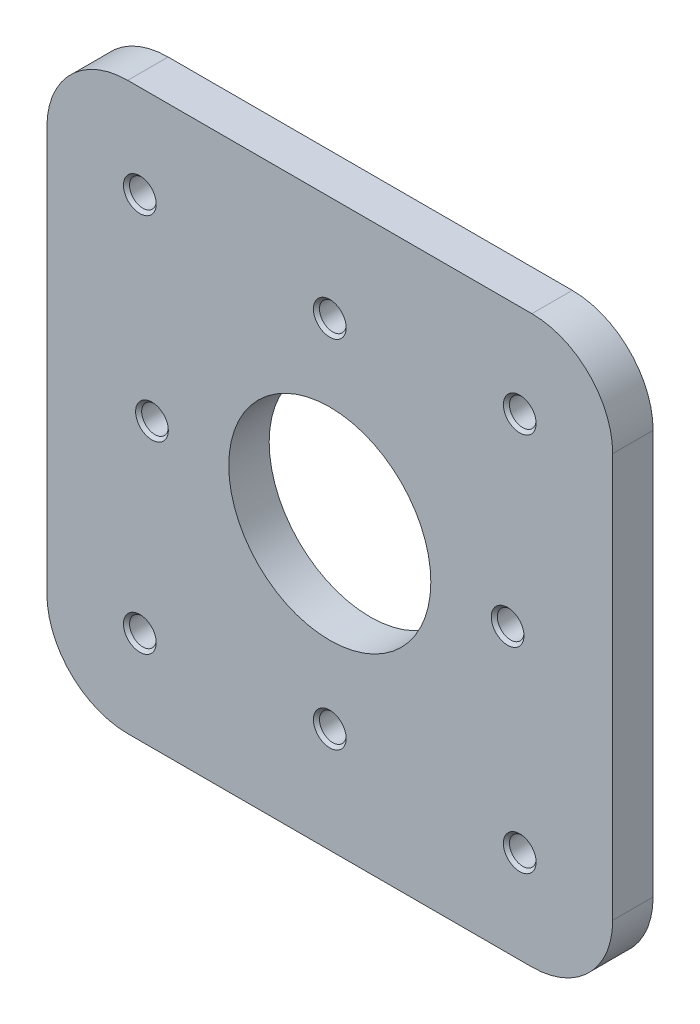
ISO-10303-21;
HEADER;
FILE_DESCRIPTION(('STEP AP214'),'2;1');
FILE_NAME('part.step','',(''),(''),'','','');
FILE_SCHEMA(('AUTOMOTIVE_DESIGN { 1 0 10303 214 1 1 1 1 }'));
ENDSEC;
DATA;
#1=APPLICATION_CONTEXT('core data for automotive mechanical design processes');
#2=APPLICATION_PROTOCOL_DEFINITION('international standard','automotive_design',2000,#1);
#3=PRODUCT_CONTEXT('',#1,'mechanical');
#4=PRODUCT('Part','Part','',(#3));
#5=PRODUCT_RELATED_PRODUCT_CATEGORY('part','',(#4));
#6=PRODUCT_DEFINITION_FORMATION('','',#4);
#7=PRODUCT_DEFINITION_CONTEXT('part definition',#1,'design');
#8=PRODUCT_DEFINITION('design','',#6,#7);
#9=PRODUCT_DEFINITION_SHAPE('','',#8);
#10=(LENGTH_UNIT() NAMED_UNIT(*) SI_UNIT(.MILLI.,.METRE.));
#11=(NAMED_UNIT(*) PLANE_ANGLE_UNIT() SI_UNIT($,.RADIAN.));
#12=(NAMED_UNIT(*) SI_UNIT($,.STERADIAN.) SOLID_ANGLE_UNIT());
#13=UNCERTAINTY_MEASURE_WITH_UNIT(LENGTH_MEASURE(1.E-05),#10,'distance_accuracy_value','');
#14=(GEOMETRIC_REPRESENTATION_CONTEXT(3) GLOBAL_UNCERTAINTY_ASSIGNED_CONTEXT((#13)) GLOBAL_UNIT_ASSIGNED_CONTEXT((#10,
#11,#12)) REPRESENTATION_CONTEXT('',''));
#15=CARTESIAN_POINT('',(0.,0.,0.));
#16=DIRECTION('',(0.,0.,1.));
#17=DIRECTION('',(1.,0.,0.));
#18=AXIS2_PLACEMENT_3D('',#15,#16,#17);
#19=CARTESIAN_POINT('',(35.,-35.,-5.));
#20=DIRECTION('',(1.,0.,0.));
#21=DIRECTION('',(0.,0.,-1.));
#22=AXIS2_PLACEMENT_3D('',#19,#20,#21);
#23=PLANE('',#22);
#24=DIRECTION('',(0.,1.,0.));
#25=VECTOR('',#24,1.);
#26=CARTESIAN_POINT('',(35.,-35.,-5.));
#27=LINE('',#26,#25);
#28=CARTESIAN_POINT('',(35.,-25.,-5.));
#29=VERTEX_POINT('',#28);
#30=CARTESIAN_POINT('',(35.,25.,-5.));
#31=VERTEX_POINT('',#30);
#32=EDGE_CURVE('E170',#29,#31,#27,.T.);
#33=ORIENTED_EDGE('',*,*,#32,.T.);
#34=DIRECTION('',(0.,0.,1.));
#35=VECTOR('',#34,1.);
#36=CARTESIAN_POINT('',(35.,25.,-5.));
#37=LINE('',#36,#35);
#38=CARTESIAN_POINT('',(35.,25.,0.));
#39=VERTEX_POINT('',#38);
#40=EDGE_CURVE('E122',#31,#39,#37,.T.);
#41=ORIENTED_EDGE('',*,*,#40,.T.);
#42=DIRECTION('',(0.,1.,0.));
#43=VECTOR('',#42,1.);
#44=CARTESIAN_POINT('',(35.,-35.,0.));
#45=LINE('',#44,#43);
#46=CARTESIAN_POINT('',(35.,-25.,0.));
#47=VERTEX_POINT('',#46);
#48=EDGE_CURVE('E106',#47,#39,#45,.T.);
#49=ORIENTED_EDGE('',*,*,#48,.F.);
#50=DIRECTION('',(0.,0.,1.));
#51=VECTOR('',#50,1.);
#52=CARTESIAN_POINT('',(35.,-25.,-5.));
#53=LINE('',#52,#51);
#54=EDGE_CURVE('E119',#47,#29,#53,.F.);
#55=ORIENTED_EDGE('',*,*,#54,.T.);
#56=EDGE_LOOP('',(#33,#41,#49,#55));
#57=FACE_BOUND('',#56,.T.);
#58=ADVANCED_FACE('F37',(#57),#23,.T.);
#59=CARTESIAN_POINT('',(-35.,-35.,-5.));
#60=DIRECTION('',(0.,-1.,0.));
#61=DIRECTION('',(0.,0.,-1.));
#62=AXIS2_PLACEMENT_3D('',#59,#60,#61);
#63=PLANE('',#62);
#64=DIRECTION('',(1.,0.,0.));
#65=VECTOR('',#64,1.);
#66=CARTESIAN_POINT('',(-35.,-35.,-5.));
#67=LINE('',#66,#65);
#68=CARTESIAN_POINT('',(-25.,-35.,-5.));
#69=VERTEX_POINT('',#68);
#70=CARTESIAN_POINT('',(25.,-35.,-5.));
#71=VERTEX_POINT('',#70);
#72=EDGE_CURVE('E129',#69,#71,#67,.T.);
#73=ORIENTED_EDGE('',*,*,#72,.T.);
#74=DIRECTION('',(0.,0.,1.));
#75=VECTOR('',#74,1.);
#76=CARTESIAN_POINT('',(25.,-35.,-5.));
#77=LINE('',#76,#75);
#78=CARTESIAN_POINT('',(25.,-35.,0.));
#79=VERTEX_POINT('',#78);
#80=EDGE_CURVE('E156',#71,#79,#77,.T.);
#81=ORIENTED_EDGE('',*,*,#80,.T.);
#82=DIRECTION('',(1.,0.,0.));
#83=VECTOR('',#82,1.);
#84=CARTESIAN_POINT('',(-35.,-35.,0.));
#85=LINE('',#84,#83);
#86=CARTESIAN_POINT('',(-25.,-35.,0.));
#87=VERTEX_POINT('',#86);
#88=EDGE_CURVE('E108',#87,#79,#85,.T.);
#89=ORIENTED_EDGE('',*,*,#88,.F.);
#90=DIRECTION('',(0.,0.,1.));
#91=VECTOR('',#90,1.);
#92=CARTESIAN_POINT('',(-25.,-35.,-5.));
#93=LINE('',#92,#91);
#94=EDGE_CURVE('E154',#87,#69,#93,.F.);
#95=ORIENTED_EDGE('',*,*,#94,.T.);
#96=EDGE_LOOP('',(#73,#81,#89,#95));
#97=FACE_BOUND('',#96,.T.);
#98=ADVANCED_FACE('F158',(#97),#63,.T.);
#99=CARTESIAN_POINT('',(-35.,-35.,-5.));
#100=DIRECTION('',(-1.,0.,0.));
#101=DIRECTION('',(0.,0.,1.));
#102=AXIS2_PLACEMENT_3D('',#99,#100,#101);
#103=PLANE('',#102);
#104=DIRECTION('',(0.,-1.,0.));
#105=VECTOR('',#104,1.);
#106=CARTESIAN_POINT('',(-35.,-35.,-5.));
#107=LINE('',#106,#105);
#108=CARTESIAN_POINT('',(-35.,25.,-5.));
#109=VERTEX_POINT('',#108);
#110=CARTESIAN_POINT('',(-35.,-25.,-5.));
#111=VERTEX_POINT('',#110);
#112=EDGE_CURVE('E134',#109,#111,#107,.T.);
#113=ORIENTED_EDGE('',*,*,#112,.T.);
#114=DIRECTION('',(0.,0.,1.));
#115=VECTOR('',#114,1.);
#116=CARTESIAN_POINT('',(-35.,-25.,-5.));
#117=LINE('',#116,#115);
#118=CARTESIAN_POINT('',(-35.,-25.,0.));
#119=VERTEX_POINT('',#118);
#120=EDGE_CURVE('E11',#111,#119,#117,.T.);
#121=ORIENTED_EDGE('',*,*,#120,.T.);
#122=DIRECTION('',(0.,-1.,0.));
#123=VECTOR('',#122,1.);
#124=CARTESIAN_POINT('',(-35.,-35.,0.));
#125=LINE('',#124,#123);
#126=CARTESIAN_POINT('',(-35.,25.,0.));
#127=VERTEX_POINT('',#126);
#128=EDGE_CURVE('E167',#127,#119,#125,.T.);
#129=ORIENTED_EDGE('',*,*,#128,.F.);
#130=DIRECTION('',(0.,0.,1.));
#131=VECTOR('',#130,1.);
#132=CARTESIAN_POINT('',(-35.,25.,-5.));
#133=LINE('',#132,#131);
#134=EDGE_CURVE('E45',#127,#109,#133,.F.);
#135=ORIENTED_EDGE('',*,*,#134,.T.);
#136=EDGE_LOOP('',(#113,#121,#129,#135));
#137=FACE_BOUND('',#136,.T.);
#138=ADVANCED_FACE('F166',(#137),#103,.T.);
#139=CARTESIAN_POINT('',(-35.,35.,-5.));
#140=DIRECTION('',(0.,1.,0.));
#141=DIRECTION('',(0.,0.,1.));
#142=AXIS2_PLACEMENT_3D('',#139,#140,#141);
#143=PLANE('',#142);
#144=DIRECTION('',(-1.,0.,0.));
#145=VECTOR('',#144,1.);
#146=CARTESIAN_POINT('',(-35.,35.,0.));
#147=LINE('',#146,#145);
#148=CARTESIAN_POINT('',(25.,35.,0.));
#149=VERTEX_POINT('',#148);
#150=CARTESIAN_POINT('',(-25.,35.,0.));
#151=VERTEX_POINT('',#150);
#152=EDGE_CURVE('E123',#149,#151,#147,.T.);
#153=ORIENTED_EDGE('',*,*,#152,.F.);
#154=DIRECTION('',(0.,0.,1.));
#155=VECTOR('',#154,1.);
#156=CARTESIAN_POINT('',(25.,35.,-5.));
#157=LINE('',#156,#155);
#158=CARTESIAN_POINT('',(25.,35.,-5.));
#159=VERTEX_POINT('',#158);
#160=EDGE_CURVE('E146',#149,#159,#157,.F.);
#161=ORIENTED_EDGE('',*,*,#160,.T.);
#162=DIRECTION('',(-1.,0.,0.));
#163=VECTOR('',#162,1.);
#164=CARTESIAN_POINT('',(-35.,35.,-5.));
#165=LINE('',#164,#163);
#166=CARTESIAN_POINT('',(-25.,35.,-5.));
#167=VERTEX_POINT('',#166);
#168=EDGE_CURVE('E247',#159,#167,#165,.T.);
#169=ORIENTED_EDGE('',*,*,#168,.T.);
#170=DIRECTION('',(0.,0.,1.));
#171=VECTOR('',#170,1.);
#172=CARTESIAN_POINT('',(-25.,35.,-5.));
#173=LINE('',#172,#171);
#174=EDGE_CURVE('E143',#167,#151,#173,.T.);
#175=ORIENTED_EDGE('',*,*,#174,.T.);
#176=EDGE_LOOP('',(#153,#161,#169,#175));
#177=FACE_BOUND('',#176,.T.);
#178=ADVANCED_FACE('F253',(#177),#143,.T.);
#179=CARTESIAN_POINT('',(0.,0.,-5.));
#180=DIRECTION('',(0.,0.,-1.));
#181=DIRECTION('',(-1.,0.,0.));
#182=AXIS2_PLACEMENT_3D('',#179,#180,#181);
#183=PLANE('',#182);
#184=CARTESIAN_POINT('',(-23.5,23.5,-5.));
#185=DIRECTION('',(0.,0.,-1.));
#186=DIRECTION('',(-1.,0.,0.));
#187=AXIS2_PLACEMENT_3D('',#184,#185,#186);
#188=CIRCLE('',#187,1.65);
#189=CARTESIAN_POINT('',(-25.15,23.5,-5.));
#190=VERTEX_POINT('',#189);
#191=EDGE_CURVE('E137',#190,#190,#188,.T.);
#192=ORIENTED_EDGE('',*,*,#191,.F.);
#193=EDGE_LOOP('',(#192));
#194=FACE_BOUND('',#193,.T.);
#195=CARTESIAN_POINT('',(23.5,23.5,-5.));
#196=DIRECTION('',(0.,0.,-1.));
#197=DIRECTION('',(-1.,0.,0.));
#198=AXIS2_PLACEMENT_3D('',#195,#196,#197);
#199=CIRCLE('',#198,1.65);
#200=CARTESIAN_POINT('',(21.85,23.5,-5.));
#201=VERTEX_POINT('',#200);
#202=EDGE_CURVE('E203',#201,#201,#199,.T.);
#203=ORIENTED_EDGE('',*,*,#202,.F.);
#204=EDGE_LOOP('',(#203));
#205=FACE_BOUND('',#204,.T.);
#206=CARTESIAN_POINT('',(23.5,-23.5,-5.));
#207=DIRECTION('',(0.,0.,-1.));
#208=DIRECTION('',(-1.,0.,0.));
#209=AXIS2_PLACEMENT_3D('',#206,#207,#208);
#210=CIRCLE('',#209,1.65);
#211=CARTESIAN_POINT('',(21.85,-23.5,-5.));
#212=VERTEX_POINT('',#211);
#213=EDGE_CURVE('E199',#212,#212,#210,.T.);
#214=ORIENTED_EDGE('',*,*,#213,.F.);
#215=EDGE_LOOP('',(#214));
#216=FACE_BOUND('',#215,.T.);
#217=CARTESIAN_POINT('',(-23.5,-23.5,-5.));
#218=DIRECTION('',(0.,0.,-1.));
#219=DIRECTION('',(-1.,0.,0.));
#220=AXIS2_PLACEMENT_3D('',#217,#218,#219);
#221=CIRCLE('',#220,1.65);
#222=CARTESIAN_POINT('',(-25.15,-23.5,-5.));
#223=VERTEX_POINT('',#222);
#224=EDGE_CURVE('E194',#223,#223,#221,.T.);
#225=ORIENTED_EDGE('',*,*,#224,.F.);
#226=EDGE_LOOP('',(#225));
#227=FACE_BOUND('',#226,.T.);
#228=CARTESIAN_POINT('',(0.,22.,-5.));
#229=DIRECTION('',(0.,0.,-1.));
#230=DIRECTION('',(-1.,0.,0.));
#231=AXIS2_PLACEMENT_3D('',#228,#229,#230);
#232=CIRCLE('',#231,1.65);
#233=CARTESIAN_POINT('',(-1.65,22.,-5.));
#234=VERTEX_POINT('',#233);
#235=EDGE_CURVE('E189',#234,#234,#232,.T.);
#236=ORIENTED_EDGE('',*,*,#235,.F.);
#237=EDGE_LOOP('',(#236));
#238=FACE_BOUND('',#237,.T.);
#239=CARTESIAN_POINT('',(-21.9999999999994,-6.16991602085919E-13,-5.));
#240=DIRECTION('',(0.,0.,-1.));
#241=DIRECTION('',(-1.,0.,0.));
#242=AXIS2_PLACEMENT_3D('',#239,#240,#241);
#243=CIRCLE('',#242,1.65);
#244=CARTESIAN_POINT('',(-23.6499999999994,-6.16991602085919E-13,-5.));
#245=VERTEX_POINT('',#244);
#246=EDGE_CURVE('E184',#245,#245,#243,.T.);
#247=ORIENTED_EDGE('',*,*,#246,.F.);
#248=EDGE_LOOP('',(#247));
#249=FACE_BOUND('',#248,.T.);
#250=CARTESIAN_POINT('',(1.22859475825559E-12,-22.,-5.));
#251=DIRECTION('',(0.,0.,-1.));
#252=DIRECTION('',(-1.,0.,0.));
#253=AXIS2_PLACEMENT_3D('',#250,#251,#252);
#254=CIRCLE('',#253,1.65);
#255=CARTESIAN_POINT('',(-1.64999999999877,-22.,-5.));
#256=VERTEX_POINT('',#255);
#257=EDGE_CURVE('E179',#256,#256,#254,.T.);
#258=ORIENTED_EDGE('',*,*,#257,.F.);
#259=EDGE_LOOP('',(#258));
#260=FACE_BOUND('',#259,.T.);
#261=CARTESIAN_POINT('',(22.0000000000006,6.14297379127794E-13,-5.));
#262=DIRECTION('',(0.,0.,-1.));
#263=DIRECTION('',(-1.,0.,0.));
#264=AXIS2_PLACEMENT_3D('',#261,#262,#263);
#265=CIRCLE('',#264,1.65);
#266=CARTESIAN_POINT('',(20.3500000000006,6.14297379127794E-13,-5.));
#267=VERTEX_POINT('',#266);
#268=EDGE_CURVE('E174',#267,#267,#265,.T.);
#269=ORIENTED_EDGE('',*,*,#268,.F.);
#270=EDGE_LOOP('',(#269));
#271=FACE_BOUND('',#270,.T.);
#272=CARTESIAN_POINT('',(0.,0.,-5.));
#273=DIRECTION('',(0.,0.,1.));
#274=DIRECTION('',(1.,0.,0.));
#275=AXIS2_PLACEMENT_3D('',#272,#273,#274);
#276=CIRCLE('',#275,12.5);
#277=CARTESIAN_POINT('',(12.5,0.,-5.));
#278=VERTEX_POINT('',#277);
#279=EDGE_CURVE('E124',#278,#278,#276,.T.);
#280=ORIENTED_EDGE('',*,*,#279,.T.);
#281=EDGE_LOOP('',(#280));
#282=FACE_BOUND('',#281,.T.);
#283=ORIENTED_EDGE('',*,*,#168,.F.);
#284=CARTESIAN_POINT('',(25.,25.,-5.));
#285=DIRECTION('',(0.,0.,-1.));
#286=DIRECTION('',(-1.,0.,0.));
#287=AXIS2_PLACEMENT_3D('',#284,#285,#286);
#288=CIRCLE('',#287,10.);
#289=EDGE_CURVE('E152',#159,#31,#288,.T.);
#290=ORIENTED_EDGE('',*,*,#289,.T.);
#291=ORIENTED_EDGE('',*,*,#32,.F.);
#292=CARTESIAN_POINT('',(25.,-25.,-5.));
#293=DIRECTION('',(0.,0.,-1.));
#294=DIRECTION('',(-1.,0.,0.));
#295=AXIS2_PLACEMENT_3D('',#292,#293,#294);
#296=CIRCLE('',#295,10.);
#297=EDGE_CURVE('E128',#29,#71,#296,.T.);
#298=ORIENTED_EDGE('',*,*,#297,.T.);
#299=ORIENTED_EDGE('',*,*,#72,.F.);
#300=CARTESIAN_POINT('',(-25.,-25.,-5.));
#301=DIRECTION('',(0.,0.,-1.));
#302=DIRECTION('',(-1.,0.,0.));
#303=AXIS2_PLACEMENT_3D('',#300,#301,#302);
#304=CIRCLE('',#303,10.);
#305=EDGE_CURVE('E52',#69,#111,#304,.T.);
#306=ORIENTED_EDGE('',*,*,#305,.T.);
#307=ORIENTED_EDGE('',*,*,#112,.F.);
#308=CARTESIAN_POINT('',(-25.,25.,-5.));
#309=DIRECTION('',(0.,0.,-1.));
#310=DIRECTION('',(-1.,0.,0.));
#311=AXIS2_PLACEMENT_3D('',#308,#309,#310);
#312=CIRCLE('',#311,10.);
#313=EDGE_CURVE('E148',#109,#167,#312,.T.);
#314=ORIENTED_EDGE('',*,*,#313,.T.);
#315=EDGE_LOOP('',(#283,#290,#291,#298,#299,#306,#307,#314));
#316=FACE_BOUND('',#315,.T.);
#317=ADVANCED_FACE('F161',(#194,#205,#216,#227,#238,#249,#260,#271,#282,#316),#183,.T.);
#318=CARTESIAN_POINT('',(0.,0.,0.));
#319=DIRECTION('',(0.,0.,-1.));
#320=DIRECTION('',(-1.,0.,0.));
#321=AXIS2_PLACEMENT_3D('',#318,#319,#320);
#322=PLANE('',#321);
#323=CARTESIAN_POINT('',(-23.5,23.5,0.));
#324=DIRECTION('',(0.,0.,1.));
#325=DIRECTION('',(1.,0.,0.));
#326=AXIS2_PLACEMENT_3D('',#323,#324,#325);
#327=CIRCLE('',#326,2.025);
#328=CARTESIAN_POINT('',(-21.475,23.5,0.));
#329=VERTEX_POINT('',#328);
#330=EDGE_CURVE('E575',#329,#329,#327,.T.);
#331=ORIENTED_EDGE('',*,*,#330,.F.);
#332=EDGE_LOOP('',(#331));
#333=FACE_BOUND('',#332,.T.);
#334=CARTESIAN_POINT('',(23.5,23.5,0.));
#335=DIRECTION('',(0.,0.,1.));
#336=DIRECTION('',(1.,0.,0.));
#337=AXIS2_PLACEMENT_3D('',#334,#335,#336);
#338=CIRCLE('',#337,2.025);
#339=CARTESIAN_POINT('',(25.525,23.5,0.));
#340=VERTEX_POINT('',#339);
#341=EDGE_CURVE('E212',#340,#340,#338,.T.);
#342=ORIENTED_EDGE('',*,*,#341,.F.);
#343=EDGE_LOOP('',(#342));
#344=FACE_BOUND('',#343,.T.);
#345=CARTESIAN_POINT('',(23.5,-23.5,0.));
#346=DIRECTION('',(0.,0.,1.));
#347=DIRECTION('',(1.,0.,0.));
#348=AXIS2_PLACEMENT_3D('',#345,#346,#347);
#349=CIRCLE('',#348,2.025);
#350=CARTESIAN_POINT('',(25.525,-23.5,0.));
#351=VERTEX_POINT('',#350);
#352=EDGE_CURVE('E205',#351,#351,#349,.T.);
#353=ORIENTED_EDGE('',*,*,#352,.F.);
#354=EDGE_LOOP('',(#353));
#355=FACE_BOUND('',#354,.T.);
#356=CARTESIAN_POINT('',(-23.5,-23.5,0.));
#357=DIRECTION('',(0.,0.,1.));
#358=DIRECTION('',(1.,0.,0.));
#359=AXIS2_PLACEMENT_3D('',#356,#357,#358);
#360=CIRCLE('',#359,2.025);
#361=CARTESIAN_POINT('',(-21.475,-23.5,0.));
#362=VERTEX_POINT('',#361);
#363=EDGE_CURVE('E201',#362,#362,#360,.T.);
#364=ORIENTED_EDGE('',*,*,#363,.F.);
#365=EDGE_LOOP('',(#364));
#366=FACE_BOUND('',#365,.T.);
#367=CARTESIAN_POINT('',(0.,22.,0.));
#368=DIRECTION('',(0.,0.,1.));
#369=DIRECTION('',(1.,0.,0.));
#370=AXIS2_PLACEMENT_3D('',#367,#368,#369);
#371=CIRCLE('',#370,2.025);
#372=CARTESIAN_POINT('',(2.02499999999999,22.,0.));
#373=VERTEX_POINT('',#372);
#374=EDGE_CURVE('E197',#373,#373,#371,.T.);
#375=ORIENTED_EDGE('',*,*,#374,.F.);
#376=EDGE_LOOP('',(#375));
#377=FACE_BOUND('',#376,.T.);
#378=CARTESIAN_POINT('',(-21.9999999999994,-6.16991602085919E-13,0.));
#379=DIRECTION('',(0.,0.,1.));
#380=DIRECTION('',(1.,0.,0.));
#381=AXIS2_PLACEMENT_3D('',#378,#379,#380);
#382=CIRCLE('',#381,2.025);
#383=CARTESIAN_POINT('',(-19.9749999999994,-6.16991602085919E-13,0.));
#384=VERTEX_POINT('',#383);
#385=EDGE_CURVE('E192',#384,#384,#382,.T.);
#386=ORIENTED_EDGE('',*,*,#385,.F.);
#387=EDGE_LOOP('',(#386));
#388=FACE_BOUND('',#387,.T.);
#389=CARTESIAN_POINT('',(1.22859475825559E-12,-22.,0.));
#390=DIRECTION('',(0.,0.,1.));
#391=DIRECTION('',(1.,0.,0.));
#392=AXIS2_PLACEMENT_3D('',#389,#390,#391);
#393=CIRCLE('',#392,2.025);
#394=CARTESIAN_POINT('',(2.02500000000123,-22.,0.));
#395=VERTEX_POINT('',#394);
#396=EDGE_CURVE('E187',#395,#395,#393,.T.);
#397=ORIENTED_EDGE('',*,*,#396,.F.);
#398=EDGE_LOOP('',(#397));
#399=FACE_BOUND('',#398,.T.);
#400=CARTESIAN_POINT('',(22.0000000000006,6.14297379127794E-13,0.));
#401=DIRECTION('',(0.,0.,1.));
#402=DIRECTION('',(1.,0.,0.));
#403=AXIS2_PLACEMENT_3D('',#400,#401,#402);
#404=CIRCLE('',#403,2.025);
#405=CARTESIAN_POINT('',(24.0250000000006,6.14297379127794E-13,0.));
#406=VERTEX_POINT('',#405);
#407=EDGE_CURVE('E182',#406,#406,#404,.T.);
#408=ORIENTED_EDGE('',*,*,#407,.F.);
#409=EDGE_LOOP('',(#408));
#410=FACE_BOUND('',#409,.T.);
#411=CARTESIAN_POINT('',(0.,0.,0.));
#412=DIRECTION('',(0.,0.,1.));
#413=DIRECTION('',(1.,0.,0.));
#414=AXIS2_PLACEMENT_3D('',#411,#412,#413);
#415=CIRCLE('',#414,12.5);
#416=CARTESIAN_POINT('',(12.5,0.,0.));
#417=VERTEX_POINT('',#416);
#418=EDGE_CURVE('E177',#417,#417,#415,.T.);
#419=ORIENTED_EDGE('',*,*,#418,.F.);
#420=EDGE_LOOP('',(#419));
#421=FACE_BOUND('',#420,.T.);
#422=ORIENTED_EDGE('',*,*,#48,.T.);
#423=CARTESIAN_POINT('',(25.,25.,0.));
#424=DIRECTION('',(0.,0.,-1.));
#425=DIRECTION('',(-1.,0.,0.));
#426=AXIS2_PLACEMENT_3D('',#423,#424,#425);
#427=CIRCLE('',#426,10.);
#428=EDGE_CURVE('E113',#39,#149,#427,.F.);
#429=ORIENTED_EDGE('',*,*,#428,.T.);
#430=ORIENTED_EDGE('',*,*,#152,.T.);
#431=CARTESIAN_POINT('',(-25.,25.,0.));
#432=DIRECTION('',(0.,0.,-1.));
#433=DIRECTION('',(-1.,0.,0.));
#434=AXIS2_PLACEMENT_3D('',#431,#432,#433);
#435=CIRCLE('',#434,10.);
#436=EDGE_CURVE('E131',#151,#127,#435,.F.);
#437=ORIENTED_EDGE('',*,*,#436,.T.);
#438=ORIENTED_EDGE('',*,*,#128,.T.);
#439=CARTESIAN_POINT('',(-25.,-25.,0.));
#440=DIRECTION('',(0.,0.,-1.));
#441=DIRECTION('',(-1.,0.,0.));
#442=AXIS2_PLACEMENT_3D('',#439,#440,#441);
#443=CIRCLE('',#442,10.);
#444=EDGE_CURVE('E114',#119,#87,#443,.F.);
#445=ORIENTED_EDGE('',*,*,#444,.T.);
#446=ORIENTED_EDGE('',*,*,#88,.T.);
#447=CARTESIAN_POINT('',(25.,-25.,0.));
#448=DIRECTION('',(0.,0.,-1.));
#449=DIRECTION('',(-1.,0.,0.));
#450=AXIS2_PLACEMENT_3D('',#447,#448,#449);
#451=CIRCLE('',#450,10.);
#452=EDGE_CURVE('E103',#79,#47,#451,.F.);
#453=ORIENTED_EDGE('',*,*,#452,.T.);
#454=EDGE_LOOP('',(#422,#429,#430,#437,#438,#445,#446,#453));
#455=FACE_BOUND('',#454,.T.);
#456=ADVANCED_FACE('F105',(#333,#344,#355,#366,#377,#388,#399,#410,#421,#455),#322,.F.);
#457=CARTESIAN_POINT('',(0.,0.,-5.));
#458=DIRECTION('',(0.,0.,1.));
#459=DIRECTION('',(1.,0.,0.));
#460=AXIS2_PLACEMENT_3D('',#457,#458,#459);
#461=CYLINDRICAL_SURFACE('',#460,12.5);
#462=ORIENTED_EDGE('',*,*,#279,.F.);
#463=EDGE_LOOP('',(#462));
#464=FACE_BOUND('',#463,.T.);
#465=ORIENTED_EDGE('',*,*,#418,.T.);
#466=EDGE_LOOP('',(#465));
#467=FACE_BOUND('',#466,.T.);
#468=ADVANCED_FACE('F440',(#464,#467),#461,.F.);
#469=CARTESIAN_POINT('',(22.0000000000006,6.14297379127794E-13,0.));
#470=DIRECTION('',(0.,0.,1.));
#471=DIRECTION('',(1.,0.,0.));
#472=AXIS2_PLACEMENT_3D('',#469,#470,#471);
#473=CYLINDRICAL_SURFACE('',#472,1.65);
#474=ORIENTED_EDGE('',*,*,#268,.T.);
#475=EDGE_LOOP('',(#474));
#476=FACE_BOUND('',#475,.T.);
#477=CARTESIAN_POINT('',(22.0000000000006,6.14297379127794E-13,-0.375));
#478=DIRECTION('',(0.,0.,1.));
#479=DIRECTION('',(1.,0.,0.));
#480=AXIS2_PLACEMENT_3D('',#477,#478,#479);
#481=CIRCLE('',#480,1.65);
#482=CARTESIAN_POINT('',(23.6500000000006,6.14297379127794E-13,-0.375));
#483=VERTEX_POINT('',#482);
#484=EDGE_CURVE('E178',#483,#483,#481,.T.);
#485=ORIENTED_EDGE('',*,*,#484,.T.);
#486=EDGE_LOOP('',(#485));
#487=FACE_BOUND('',#486,.T.);
#488=ADVANCED_FACE('F431',(#476,#487),#473,.F.);
#489=CARTESIAN_POINT('',(22.0000000000006,6.14297379127794E-13,0.));
#490=DIRECTION('',(0.,0.,1.));
#491=DIRECTION('',(1.,0.,0.));
#492=AXIS2_PLACEMENT_3D('',#489,#490,#491);
#493=CONICAL_SURFACE('',#492,2.025,0.785398163397448);
#494=ORIENTED_EDGE('',*,*,#484,.F.);
#495=EDGE_LOOP('',(#494));
#496=FACE_BOUND('',#495,.T.);
#497=ORIENTED_EDGE('',*,*,#407,.T.);
#498=EDGE_LOOP('',(#497));
#499=FACE_BOUND('',#498,.T.);
#500=ADVANCED_FACE('F422',(#496,#499),#493,.F.);
#501=CARTESIAN_POINT('',(1.22859475825559E-12,-22.,0.));
#502=DIRECTION('',(0.,0.,1.));
#503=DIRECTION('',(1.,0.,0.));
#504=AXIS2_PLACEMENT_3D('',#501,#502,#503);
#505=CYLINDRICAL_SURFACE('',#504,1.65);
#506=ORIENTED_EDGE('',*,*,#257,.T.);
#507=EDGE_LOOP('',(#506));
#508=FACE_BOUND('',#507,.T.);
#509=CARTESIAN_POINT('',(1.22859475825559E-12,-22.,-0.375));
#510=DIRECTION('',(0.,0.,1.));
#511=DIRECTION('',(1.,0.,0.));
#512=AXIS2_PLACEMENT_3D('',#509,#510,#511);
#513=CIRCLE('',#512,1.65);
#514=CARTESIAN_POINT('',(1.65000000000123,-22.,-0.375));
#515=VERTEX_POINT('',#514);
#516=EDGE_CURVE('E183',#515,#515,#513,.T.);
#517=ORIENTED_EDGE('',*,*,#516,.T.);
#518=EDGE_LOOP('',(#517));
#519=FACE_BOUND('',#518,.T.);
#520=ADVANCED_FACE('F413',(#508,#519),#505,.F.);
#521=CARTESIAN_POINT('',(1.22859475825559E-12,-22.,0.));
#522=DIRECTION('',(0.,0.,1.));
#523=DIRECTION('',(1.,0.,0.));
#524=AXIS2_PLACEMENT_3D('',#521,#522,#523);
#525=CONICAL_SURFACE('',#524,2.025,0.78539816339745);
#526=ORIENTED_EDGE('',*,*,#516,.F.);
#527=EDGE_LOOP('',(#526));
#528=FACE_BOUND('',#527,.T.);
#529=ORIENTED_EDGE('',*,*,#396,.T.);
#530=EDGE_LOOP('',(#529));
#531=FACE_BOUND('',#530,.T.);
#532=ADVANCED_FACE('F404',(#528,#531),#525,.F.);
#533=CARTESIAN_POINT('',(-21.9999999999994,-6.16991602085919E-13,0.));
#534=DIRECTION('',(0.,0.,1.));
#535=DIRECTION('',(1.,0.,0.));
#536=AXIS2_PLACEMENT_3D('',#533,#534,#535);
#537=CYLINDRICAL_SURFACE('',#536,1.65);
#538=ORIENTED_EDGE('',*,*,#246,.T.);
#539=EDGE_LOOP('',(#538));
#540=FACE_BOUND('',#539,.T.);
#541=CARTESIAN_POINT('',(-21.9999999999994,-6.16991602085919E-13,-0.375));
#542=DIRECTION('',(0.,0.,1.));
#543=DIRECTION('',(1.,0.,0.));
#544=AXIS2_PLACEMENT_3D('',#541,#542,#543);
#545=CIRCLE('',#544,1.65);
#546=CARTESIAN_POINT('',(-20.3499999999994,-6.16991602085919E-13,-0.375));
#547=VERTEX_POINT('',#546);
#548=EDGE_CURVE('E188',#547,#547,#545,.T.);
#549=ORIENTED_EDGE('',*,*,#548,.T.);
#550=EDGE_LOOP('',(#549));
#551=FACE_BOUND('',#550,.T.);
#552=ADVANCED_FACE('F395',(#540,#551),#537,.F.);
#553=CARTESIAN_POINT('',(-21.9999999999994,-6.16991602085919E-13,0.));
#554=DIRECTION('',(0.,0.,1.));
#555=DIRECTION('',(1.,0.,0.));
#556=AXIS2_PLACEMENT_3D('',#553,#554,#555);
#557=CONICAL_SURFACE('',#556,2.025,0.785398163397448);
#558=ORIENTED_EDGE('',*,*,#548,.F.);
#559=EDGE_LOOP('',(#558));
#560=FACE_BOUND('',#559,.T.);
#561=ORIENTED_EDGE('',*,*,#385,.T.);
#562=EDGE_LOOP('',(#561));
#563=FACE_BOUND('',#562,.T.);
#564=ADVANCED_FACE('F386',(#560,#563),#557,.F.);
#565=CARTESIAN_POINT('',(0.,22.,0.));
#566=DIRECTION('',(0.,0.,1.));
#567=DIRECTION('',(1.,0.,0.));
#568=AXIS2_PLACEMENT_3D('',#565,#566,#567);
#569=CYLINDRICAL_SURFACE('',#568,1.65);
#570=ORIENTED_EDGE('',*,*,#235,.T.);
#571=EDGE_LOOP('',(#570));
#572=FACE_BOUND('',#571,.T.);
#573=CARTESIAN_POINT('',(0.,22.,-0.375));
#574=DIRECTION('',(0.,0.,1.));
#575=DIRECTION('',(1.,0.,0.));
#576=AXIS2_PLACEMENT_3D('',#573,#574,#575);
#577=CIRCLE('',#576,1.65);
#578=CARTESIAN_POINT('',(1.64999999999999,22.,-0.375));
#579=VERTEX_POINT('',#578);
#580=EDGE_CURVE('E193',#579,#579,#577,.T.);
#581=ORIENTED_EDGE('',*,*,#580,.T.);
#582=EDGE_LOOP('',(#581));
#583=FACE_BOUND('',#582,.T.);
#584=ADVANCED_FACE('F377',(#572,#583),#569,.F.);
#585=CARTESIAN_POINT('',(0.,22.,0.));
#586=DIRECTION('',(0.,0.,1.));
#587=DIRECTION('',(1.,0.,0.));
#588=AXIS2_PLACEMENT_3D('',#585,#586,#587);
#589=CONICAL_SURFACE('',#588,2.025,0.78539816339745);
#590=ORIENTED_EDGE('',*,*,#580,.F.);
#591=EDGE_LOOP('',(#590));
#592=FACE_BOUND('',#591,.T.);
#593=ORIENTED_EDGE('',*,*,#374,.T.);
#594=EDGE_LOOP('',(#593));
#595=FACE_BOUND('',#594,.T.);
#596=ADVANCED_FACE('F368',(#592,#595),#589,.F.);
#597=CARTESIAN_POINT('',(-23.5,-23.5,0.));
#598=DIRECTION('',(0.,0.,1.));
#599=DIRECTION('',(1.,0.,0.));
#600=AXIS2_PLACEMENT_3D('',#597,#598,#599);
#601=CYLINDRICAL_SURFACE('',#600,1.65);
#602=ORIENTED_EDGE('',*,*,#224,.T.);
#603=EDGE_LOOP('',(#602));
#604=FACE_BOUND('',#603,.T.);
#605=CARTESIAN_POINT('',(-23.5,-23.5,-0.375000000000002));
#606=DIRECTION('',(0.,0.,1.));
#607=DIRECTION('',(1.,0.,0.));
#608=AXIS2_PLACEMENT_3D('',#605,#606,#607);
#609=CIRCLE('',#608,1.65);
#610=CARTESIAN_POINT('',(-21.85,-23.5,-0.375000000000002));
#611=VERTEX_POINT('',#610);
#612=EDGE_CURVE('E198',#611,#611,#609,.T.);
#613=ORIENTED_EDGE('',*,*,#612,.T.);
#614=EDGE_LOOP('',(#613));
#615=FACE_BOUND('',#614,.T.);
#616=ADVANCED_FACE('F359',(#604,#615),#601,.F.);
#617=CARTESIAN_POINT('',(-23.5,-23.5,0.));
#618=DIRECTION('',(0.,0.,1.));
#619=DIRECTION('',(1.,0.,0.));
#620=AXIS2_PLACEMENT_3D('',#617,#618,#619);
#621=CONICAL_SURFACE('',#620,2.025,0.785398163397446);
#622=ORIENTED_EDGE('',*,*,#612,.F.);
#623=EDGE_LOOP('',(#622));
#624=FACE_BOUND('',#623,.T.);
#625=ORIENTED_EDGE('',*,*,#363,.T.);
#626=EDGE_LOOP('',(#625));
#627=FACE_BOUND('',#626,.T.);
#628=ADVANCED_FACE('F350',(#624,#627),#621,.F.);
#629=CARTESIAN_POINT('',(23.5,-23.5,0.));
#630=DIRECTION('',(0.,0.,1.));
#631=DIRECTION('',(1.,0.,0.));
#632=AXIS2_PLACEMENT_3D('',#629,#630,#631);
#633=CYLINDRICAL_SURFACE('',#632,1.65);
#634=ORIENTED_EDGE('',*,*,#213,.T.);
#635=EDGE_LOOP('',(#634));
#636=FACE_BOUND('',#635,.T.);
#637=CARTESIAN_POINT('',(23.5,-23.5,-0.375000000000002));
#638=DIRECTION('',(0.,0.,1.));
#639=DIRECTION('',(1.,0.,0.));
#640=AXIS2_PLACEMENT_3D('',#637,#638,#639);
#641=CIRCLE('',#640,1.65);
#642=CARTESIAN_POINT('',(25.15,-23.5,-0.375000000000002));
#643=VERTEX_POINT('',#642);
#644=EDGE_CURVE('E202',#643,#643,#641,.T.);
#645=ORIENTED_EDGE('',*,*,#644,.T.);
#646=EDGE_LOOP('',(#645));
#647=FACE_BOUND('',#646,.T.);
#648=ADVANCED_FACE('F341',(#636,#647),#633,.F.);
#649=CARTESIAN_POINT('',(23.5,-23.5,0.));
#650=DIRECTION('',(0.,0.,1.));
#651=DIRECTION('',(1.,0.,0.));
#652=AXIS2_PLACEMENT_3D('',#649,#650,#651);
#653=CONICAL_SURFACE('',#652,2.025,0.785398163397446);
#654=ORIENTED_EDGE('',*,*,#644,.F.);
#655=EDGE_LOOP('',(#654));
#656=FACE_BOUND('',#655,.T.);
#657=ORIENTED_EDGE('',*,*,#352,.T.);
#658=EDGE_LOOP('',(#657));
#659=FACE_BOUND('',#658,.T.);
#660=ADVANCED_FACE('F333',(#656,#659),#653,.F.);
#661=CARTESIAN_POINT('',(23.5,23.5,0.));
#662=DIRECTION('',(0.,0.,1.));
#663=DIRECTION('',(1.,0.,0.));
#664=AXIS2_PLACEMENT_3D('',#661,#662,#663);
#665=CYLINDRICAL_SURFACE('',#664,1.65);
#666=ORIENTED_EDGE('',*,*,#202,.T.);
#667=EDGE_LOOP('',(#666));
#668=FACE_BOUND('',#667,.T.);
#669=CARTESIAN_POINT('',(23.5,23.5,-0.375000000000002));
#670=DIRECTION('',(0.,0.,1.));
#671=DIRECTION('',(1.,0.,0.));
#672=AXIS2_PLACEMENT_3D('',#669,#670,#671);
#673=CIRCLE('',#672,1.65);
#674=CARTESIAN_POINT('',(25.15,23.5,-0.375000000000002));
#675=VERTEX_POINT('',#674);
#676=EDGE_CURVE('E206',#675,#675,#673,.T.);
#677=ORIENTED_EDGE('',*,*,#676,.T.);
#678=EDGE_LOOP('',(#677));
#679=FACE_BOUND('',#678,.T.);
#680=ADVANCED_FACE('F324',(#668,#679),#665,.F.);
#681=CARTESIAN_POINT('',(23.5,23.5,0.));
#682=DIRECTION('',(0.,0.,1.));
#683=DIRECTION('',(1.,0.,0.));
#684=AXIS2_PLACEMENT_3D('',#681,#682,#683);
#685=CONICAL_SURFACE('',#684,2.025,0.785398163397446);
#686=ORIENTED_EDGE('',*,*,#676,.F.);
#687=EDGE_LOOP('',(#686));
#688=FACE_BOUND('',#687,.T.);
#689=ORIENTED_EDGE('',*,*,#341,.T.);
#690=EDGE_LOOP('',(#689));
#691=FACE_BOUND('',#690,.T.);
#692=ADVANCED_FACE('F315',(#688,#691),#685,.F.);
#693=CARTESIAN_POINT('',(-23.5,23.5,0.));
#694=DIRECTION('',(0.,0.,1.));
#695=DIRECTION('',(1.,0.,0.));
#696=AXIS2_PLACEMENT_3D('',#693,#694,#695);
#697=CYLINDRICAL_SURFACE('',#696,1.65);
#698=ORIENTED_EDGE('',*,*,#191,.T.);
#699=EDGE_LOOP('',(#698));
#700=FACE_BOUND('',#699,.T.);
#701=CARTESIAN_POINT('',(-23.5,23.5,-0.375000000000002));
#702=DIRECTION('',(0.,0.,1.));
#703=DIRECTION('',(1.,0.,0.));
#704=AXIS2_PLACEMENT_3D('',#701,#702,#703);
#705=CIRCLE('',#704,1.65);
#706=CARTESIAN_POINT('',(-21.85,23.5,-0.375000000000002));
#707=VERTEX_POINT('',#706);
#708=EDGE_CURVE('E573',#707,#707,#705,.T.);
#709=ORIENTED_EDGE('',*,*,#708,.T.);
#710=EDGE_LOOP('',(#709));
#711=FACE_BOUND('',#710,.T.);
#712=ADVANCED_FACE('F306',(#700,#711),#697,.F.);
#713=CARTESIAN_POINT('',(-23.5,23.5,0.));
#714=DIRECTION('',(0.,0.,1.));
#715=DIRECTION('',(1.,0.,0.));
#716=AXIS2_PLACEMENT_3D('',#713,#714,#715);
#717=CONICAL_SURFACE('',#716,2.025,0.785398163397446);
#718=ORIENTED_EDGE('',*,*,#708,.F.);
#719=EDGE_LOOP('',(#718));
#720=FACE_BOUND('',#719,.T.);
#721=ORIENTED_EDGE('',*,*,#330,.T.);
#722=EDGE_LOOP('',(#721));
#723=FACE_BOUND('',#722,.T.);
#724=ADVANCED_FACE('F274',(#720,#723),#717,.F.);
#725=CARTESIAN_POINT('',(25.,25.,-5.));
#726=DIRECTION('',(0.,0.,1.));
#727=DIRECTION('',(1.,0.,0.));
#728=AXIS2_PLACEMENT_3D('',#725,#726,#727);
#729=CYLINDRICAL_SURFACE('',#728,10.);
#730=ORIENTED_EDGE('',*,*,#289,.F.);
#731=ORIENTED_EDGE('',*,*,#160,.F.);
#732=ORIENTED_EDGE('',*,*,#428,.F.);
#733=ORIENTED_EDGE('',*,*,#40,.F.);
#734=EDGE_LOOP('',(#730,#731,#732,#733));
#735=FACE_BOUND('',#734,.T.);
#736=ADVANCED_FACE('F271',(#735),#729,.T.);
#737=CARTESIAN_POINT('',(25.,-25.,-5.));
#738=DIRECTION('',(0.,0.,1.));
#739=DIRECTION('',(1.,0.,0.));
#740=AXIS2_PLACEMENT_3D('',#737,#738,#739);
#741=CYLINDRICAL_SURFACE('',#740,10.);
#742=ORIENTED_EDGE('',*,*,#297,.F.);
#743=ORIENTED_EDGE('',*,*,#54,.F.);
#744=ORIENTED_EDGE('',*,*,#452,.F.);
#745=ORIENTED_EDGE('',*,*,#80,.F.);
#746=EDGE_LOOP('',(#742,#743,#744,#745));
#747=FACE_BOUND('',#746,.T.);
#748=ADVANCED_FACE('F127',(#747),#741,.T.);
#749=CARTESIAN_POINT('',(-25.,-25.,-5.));
#750=DIRECTION('',(0.,0.,1.));
#751=DIRECTION('',(1.,0.,0.));
#752=AXIS2_PLACEMENT_3D('',#749,#750,#751);
#753=CYLINDRICAL_SURFACE('',#752,10.);
#754=ORIENTED_EDGE('',*,*,#305,.F.);
#755=ORIENTED_EDGE('',*,*,#94,.F.);
#756=ORIENTED_EDGE('',*,*,#444,.F.);
#757=ORIENTED_EDGE('',*,*,#120,.F.);
#758=EDGE_LOOP('',(#754,#755,#756,#757));
#759=FACE_BOUND('',#758,.T.);
#760=ADVANCED_FACE('F164',(#759),#753,.T.);
#761=CARTESIAN_POINT('',(-25.,25.,-5.));
#762=DIRECTION('',(0.,0.,1.));
#763=DIRECTION('',(1.,0.,0.));
#764=AXIS2_PLACEMENT_3D('',#761,#762,#763);
#765=CYLINDRICAL_SURFACE('',#764,10.);
#766=ORIENTED_EDGE('',*,*,#313,.F.);
#767=ORIENTED_EDGE('',*,*,#134,.F.);
#768=ORIENTED_EDGE('',*,*,#436,.F.);
#769=ORIENTED_EDGE('',*,*,#174,.F.);
#770=EDGE_LOOP('',(#766,#767,#768,#769));
#771=FACE_BOUND('',#770,.T.);
#772=ADVANCED_FACE('F39',(#771),#765,.T.);
#773=CLOSED_SHELL('',(#58,#98,#138,#178,#317,#456,#468,#488,#500,#520,#532,#552,#564,#584,#596,
#616,#628,#648,#660,#680,#692,#712,#724,#736,#748,#760,#772));
#774=MANIFOLD_SOLID_BREP('B2',#773);
#775=ADVANCED_BREP_SHAPE_REPRESENTATION('',(#18,#774),#14);
#776=SHAPE_DEFINITION_REPRESENTATION(#9,#775);
ENDSEC;
END-ISO-10303-21;
